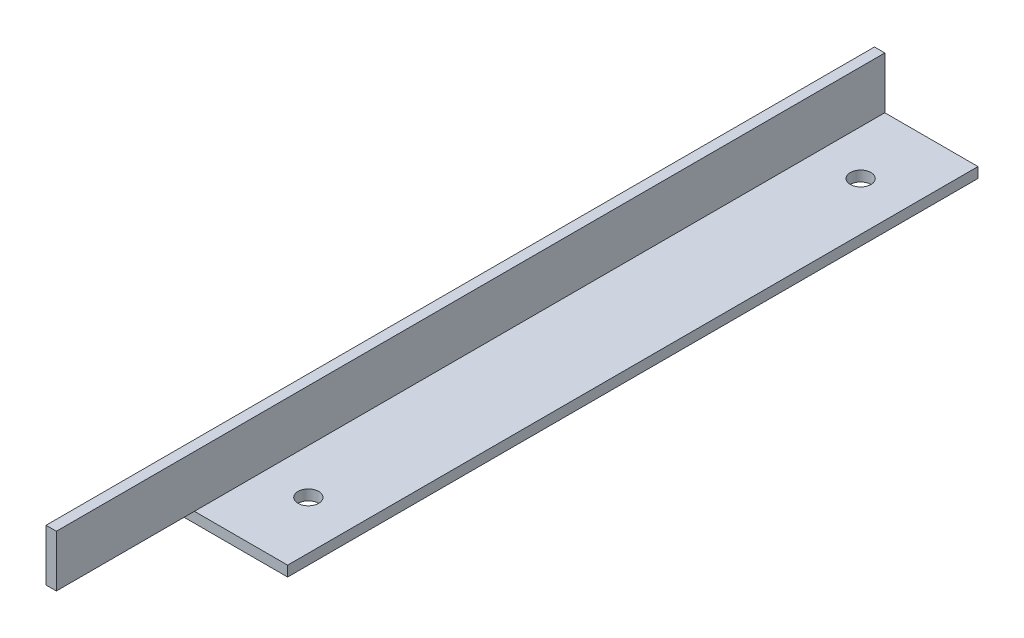
ISO-10303-21;
HEADER;
FILE_DESCRIPTION(('STEP AP214'),'2;1');
FILE_NAME('part.step','',(''),(''),'','','');
FILE_SCHEMA(('AUTOMOTIVE_DESIGN { 1 0 10303 214 1 1 1 1 }'));
ENDSEC;
DATA;
#1=APPLICATION_CONTEXT('core data for automotive mechanical design processes');
#2=APPLICATION_PROTOCOL_DEFINITION('international standard','automotive_design',2000,#1);
#3=PRODUCT_CONTEXT('',#1,'mechanical');
#4=PRODUCT('Part','Part','',(#3));
#5=PRODUCT_RELATED_PRODUCT_CATEGORY('part','',(#4));
#6=PRODUCT_DEFINITION_FORMATION('','',#4);
#7=PRODUCT_DEFINITION_CONTEXT('part definition',#1,'design');
#8=PRODUCT_DEFINITION('design','',#6,#7);
#9=PRODUCT_DEFINITION_SHAPE('','',#8);
#10=(LENGTH_UNIT() NAMED_UNIT(*) SI_UNIT(.MILLI.,.METRE.));
#11=(NAMED_UNIT(*) PLANE_ANGLE_UNIT() SI_UNIT($,.RADIAN.));
#12=(NAMED_UNIT(*) SI_UNIT($,.STERADIAN.) SOLID_ANGLE_UNIT());
#13=UNCERTAINTY_MEASURE_WITH_UNIT(LENGTH_MEASURE(1.E-05),#10,'distance_accuracy_value','');
#14=(GEOMETRIC_REPRESENTATION_CONTEXT(3) GLOBAL_UNCERTAINTY_ASSIGNED_CONTEXT((#13)) GLOBAL_UNIT_ASSIGNED_CONTEXT((#10,
#11,#12)) REPRESENTATION_CONTEXT('',''));
#15=CARTESIAN_POINT('',(0.,0.,0.));
#16=DIRECTION('',(0.,0.,1.));
#17=DIRECTION('',(1.,0.,0.));
#18=AXIS2_PLACEMENT_3D('',#15,#16,#17);
#19=CARTESIAN_POINT('',(-16.8407390114147,-0.545052631578941,100.));
#20=DIRECTION('',(0.,-1.,0.));
#21=DIRECTION('',(0.,0.,-1.));
#22=AXIS2_PLACEMENT_3D('',#19,#20,#21);
#23=PLANE('',#22);
#24=DIRECTION('',(-1.,0.,0.));
#25=VECTOR('',#24,1.);
#26=CARTESIAN_POINT('',(-16.8407390114147,-0.545052631578941,0.));
#27=LINE('',#26,#25);
#28=CARTESIAN_POINT('',(-16.8407390114147,-0.545052631578941,0.));
#29=VERTEX_POINT('',#28);
#30=CARTESIAN_POINT('',(-18.3407390114147,-0.545052631578941,0.));
#31=VERTEX_POINT('',#30);
#32=EDGE_CURVE('E144',#29,#31,#27,.T.);
#33=ORIENTED_EDGE('',*,*,#32,.T.);
#34=DIRECTION('',(0.,0.,-1.));
#35=VECTOR('',#34,1.);
#36=CARTESIAN_POINT('',(-18.3407390114147,-0.545052631578941,100.));
#37=LINE('',#36,#35);
#38=CARTESIAN_POINT('',(-18.3407390114147,-0.545052631578941,120.));
#39=VERTEX_POINT('',#38);
#40=EDGE_CURVE('E11',#39,#31,#37,.T.);
#41=ORIENTED_EDGE('',*,*,#40,.F.);
#42=DIRECTION('',(-1.,0.,0.));
#43=VECTOR('',#42,1.);
#44=CARTESIAN_POINT('',(-18.3407390114147,-0.545052631578941,120.));
#45=LINE('',#44,#43);
#46=CARTESIAN_POINT('',(-16.8407390114147,-0.545052631578941,120.));
#47=VERTEX_POINT('',#46);
#48=EDGE_CURVE('E118',#47,#39,#45,.T.);
#49=ORIENTED_EDGE('',*,*,#48,.F.);
#50=DIRECTION('',(0.,0.,-1.));
#51=VECTOR('',#50,1.);
#52=CARTESIAN_POINT('',(-16.8407390114147,-0.545052631578941,100.));
#53=LINE('',#52,#51);
#54=EDGE_CURVE('E143',#47,#29,#53,.T.);
#55=ORIENTED_EDGE('',*,*,#54,.T.);
#56=EDGE_LOOP('',(#33,#41,#49,#55));
#57=FACE_BOUND('',#56,.T.);
#58=ADVANCED_FACE('F31',(#57),#23,.F.);
#59=CARTESIAN_POINT('',(-18.3407390114147,-0.545052631578941,100.));
#60=DIRECTION('',(1.,0.,0.));
#61=DIRECTION('',(0.,1.,0.));
#62=AXIS2_PLACEMENT_3D('',#59,#60,#61);
#63=PLANE('',#62);
#64=DIRECTION('',(0.,-1.,0.));
#65=VECTOR('',#64,1.);
#66=CARTESIAN_POINT('',(-18.3407390114147,-0.545052631578941,0.));
#67=LINE('',#66,#65);
#68=CARTESIAN_POINT('',(-18.3407390114147,-9.54505263157894,0.));
#69=VERTEX_POINT('',#68);
#70=EDGE_CURVE('E147',#31,#69,#67,.T.);
#71=ORIENTED_EDGE('',*,*,#70,.T.);
#72=DIRECTION('',(0.,0.,-1.));
#73=VECTOR('',#72,1.);
#74=CARTESIAN_POINT('',(-18.3407390114147,-9.54505263157894,100.));
#75=LINE('',#74,#73);
#76=CARTESIAN_POINT('',(-18.3407390114147,-9.54505263157894,100.));
#77=VERTEX_POINT('',#76);
#78=EDGE_CURVE('E39',#77,#69,#75,.T.);
#79=ORIENTED_EDGE('',*,*,#78,.F.);
#80=DIRECTION('',(0.,-1.,0.));
#81=VECTOR('',#80,1.);
#82=CARTESIAN_POINT('',(-18.3407390114147,-0.545052631578941,100.));
#83=LINE('',#82,#81);
#84=CARTESIAN_POINT('',(-18.3407390114147,-8.04505263157894,100.));
#85=VERTEX_POINT('',#84);
#86=EDGE_CURVE('E83',#85,#77,#83,.T.);
#87=ORIENTED_EDGE('',*,*,#86,.F.);
#88=DIRECTION('',(0.,0.,-1.));
#89=VECTOR('',#88,1.);
#90=CARTESIAN_POINT('',(-18.3407390114147,-8.04505263157894,120.));
#91=LINE('',#90,#89);
#92=CARTESIAN_POINT('',(-18.3407390114147,-8.04505263157894,120.));
#93=VERTEX_POINT('',#92);
#94=EDGE_CURVE('E105',#93,#85,#91,.T.);
#95=ORIENTED_EDGE('',*,*,#94,.F.);
#96=DIRECTION('',(0.,-1.,0.));
#97=VECTOR('',#96,1.);
#98=CARTESIAN_POINT('',(-18.3407390114147,-0.545052631578941,120.));
#99=LINE('',#98,#97);
#100=EDGE_CURVE('E112',#39,#93,#99,.T.);
#101=ORIENTED_EDGE('',*,*,#100,.F.);
#102=ORIENTED_EDGE('',*,*,#40,.T.);
#103=EDGE_LOOP('',(#71,#79,#87,#95,#101,#102));
#104=FACE_BOUND('',#103,.T.);
#105=ADVANCED_FACE('F121',(#104),#63,.F.);
#106=CARTESIAN_POINT('',(-18.3407390114147,-9.54505263157894,100.));
#107=DIRECTION('',(0.,1.,0.));
#108=DIRECTION('',(0.,0.,1.));
#109=AXIS2_PLACEMENT_3D('',#106,#107,#108);
#110=PLANE('',#109);
#111=CARTESIAN_POINT('',(-10.3407390114147,-9.54505263157894,10.));
#112=DIRECTION('',(0.,1.,0.));
#113=DIRECTION('',(0.,0.,1.));
#114=AXIS2_PLACEMENT_3D('',#111,#112,#113);
#115=CIRCLE('',#114,1.5);
#116=CARTESIAN_POINT('',(-10.3407390114147,-9.54505263157894,11.5));
#117=VERTEX_POINT('',#116);
#118=EDGE_CURVE('E124',#117,#117,#115,.T.);
#119=ORIENTED_EDGE('',*,*,#118,.T.);
#120=EDGE_LOOP('',(#119));
#121=FACE_BOUND('',#120,.T.);
#122=CARTESIAN_POINT('',(-10.3407390114147,-9.54505263157894,90.));
#123=DIRECTION('',(0.,1.,0.));
#124=DIRECTION('',(0.,0.,1.));
#125=AXIS2_PLACEMENT_3D('',#122,#123,#124);
#126=CIRCLE('',#125,1.5);
#127=CARTESIAN_POINT('',(-10.3407390114147,-9.54505263157894,91.5));
#128=VERTEX_POINT('',#127);
#129=EDGE_CURVE('E137',#128,#128,#126,.T.);
#130=ORIENTED_EDGE('',*,*,#129,.T.);
#131=EDGE_LOOP('',(#130));
#132=FACE_BOUND('',#131,.T.);
#133=DIRECTION('',(1.,0.,0.));
#134=VECTOR('',#133,1.);
#135=CARTESIAN_POINT('',(-18.3407390114147,-9.54505263157894,0.));
#136=LINE('',#135,#134);
#137=CARTESIAN_POINT('',(-3.3407390114147,-9.54505263157894,0.));
#138=VERTEX_POINT('',#137);
#139=EDGE_CURVE('E149',#69,#138,#136,.T.);
#140=ORIENTED_EDGE('',*,*,#139,.T.);
#141=DIRECTION('',(0.,0.,-1.));
#142=VECTOR('',#141,1.);
#143=CARTESIAN_POINT('',(-3.3407390114147,-9.54505263157894,100.));
#144=LINE('',#143,#142);
#145=CARTESIAN_POINT('',(-3.3407390114147,-9.54505263157894,100.));
#146=VERTEX_POINT('',#145);
#147=EDGE_CURVE('E162',#146,#138,#144,.T.);
#148=ORIENTED_EDGE('',*,*,#147,.F.);
#149=DIRECTION('',(1.,0.,0.));
#150=VECTOR('',#149,1.);
#151=CARTESIAN_POINT('',(-18.3407390114147,-9.54505263157894,100.));
#152=LINE('',#151,#150);
#153=EDGE_CURVE('E132',#77,#146,#152,.T.);
#154=ORIENTED_EDGE('',*,*,#153,.F.);
#155=ORIENTED_EDGE('',*,*,#78,.T.);
#156=EDGE_LOOP('',(#140,#148,#154,#155));
#157=FACE_BOUND('',#156,.T.);
#158=ADVANCED_FACE('F168',(#121,#132,#157),#110,.F.);
#159=CARTESIAN_POINT('',(-3.3407390114147,-9.54505263157894,100.));
#160=DIRECTION('',(-1.,0.,0.));
#161=DIRECTION('',(0.,0.,1.));
#162=AXIS2_PLACEMENT_3D('',#159,#160,#161);
#163=PLANE('',#162);
#164=DIRECTION('',(0.,1.,0.));
#165=VECTOR('',#164,1.);
#166=CARTESIAN_POINT('',(-3.3407390114147,-9.54505263157894,0.));
#167=LINE('',#166,#165);
#168=CARTESIAN_POINT('',(-3.3407390114147,-8.04505263157894,0.));
#169=VERTEX_POINT('',#168);
#170=EDGE_CURVE('E151',#138,#169,#167,.T.);
#171=ORIENTED_EDGE('',*,*,#170,.T.);
#172=DIRECTION('',(0.,0.,-1.));
#173=VECTOR('',#172,1.);
#174=CARTESIAN_POINT('',(-3.3407390114147,-8.04505263157894,100.));
#175=LINE('',#174,#173);
#176=CARTESIAN_POINT('',(-3.3407390114147,-8.04505263157894,100.));
#177=VERTEX_POINT('',#176);
#178=EDGE_CURVE('E159',#177,#169,#175,.T.);
#179=ORIENTED_EDGE('',*,*,#178,.F.);
#180=DIRECTION('',(0.,1.,0.));
#181=VECTOR('',#180,1.);
#182=CARTESIAN_POINT('',(-3.3407390114147,-9.54505263157894,100.));
#183=LINE('',#182,#181);
#184=EDGE_CURVE('E54',#146,#177,#183,.T.);
#185=ORIENTED_EDGE('',*,*,#184,.F.);
#186=ORIENTED_EDGE('',*,*,#147,.T.);
#187=EDGE_LOOP('',(#171,#179,#185,#186));
#188=FACE_BOUND('',#187,.T.);
#189=ADVANCED_FACE('F176',(#188),#163,.F.);
#190=CARTESIAN_POINT('',(-3.3407390114147,-8.04505263157894,100.));
#191=DIRECTION('',(0.,-1.,0.));
#192=DIRECTION('',(1.,0.,0.));
#193=AXIS2_PLACEMENT_3D('',#190,#191,#192);
#194=PLANE('',#193);
#195=CARTESIAN_POINT('',(-10.3407390114147,-8.04505263157894,10.));
#196=DIRECTION('',(0.,1.,0.));
#197=DIRECTION('',(-1.,0.,0.));
#198=AXIS2_PLACEMENT_3D('',#195,#196,#197);
#199=CIRCLE('',#198,1.5);
#200=CARTESIAN_POINT('',(-11.8407390114147,-8.04505263157894,10.));
#201=VERTEX_POINT('',#200);
#202=EDGE_CURVE('E122',#201,#201,#199,.T.);
#203=ORIENTED_EDGE('',*,*,#202,.F.);
#204=EDGE_LOOP('',(#203));
#205=FACE_BOUND('',#204,.T.);
#206=CARTESIAN_POINT('',(-10.3407390114147,-8.04505263157894,90.));
#207=DIRECTION('',(0.,1.,0.));
#208=DIRECTION('',(-1.,0.,0.));
#209=AXIS2_PLACEMENT_3D('',#206,#207,#208);
#210=CIRCLE('',#209,1.5);
#211=CARTESIAN_POINT('',(-11.8407390114147,-8.04505263157894,90.));
#212=VERTEX_POINT('',#211);
#213=EDGE_CURVE('E186',#212,#212,#210,.T.);
#214=ORIENTED_EDGE('',*,*,#213,.F.);
#215=EDGE_LOOP('',(#214));
#216=FACE_BOUND('',#215,.T.);
#217=DIRECTION('',(-1.,0.,0.));
#218=VECTOR('',#217,1.);
#219=CARTESIAN_POINT('',(-3.3407390114147,-8.04505263157894,0.));
#220=LINE('',#219,#218);
#221=CARTESIAN_POINT('',(-16.8407390114147,-8.04505263157894,0.));
#222=VERTEX_POINT('',#221);
#223=EDGE_CURVE('E153',#169,#222,#220,.T.);
#224=ORIENTED_EDGE('',*,*,#223,.T.);
#225=DIRECTION('',(0.,0.,-1.));
#226=VECTOR('',#225,1.);
#227=CARTESIAN_POINT('',(-16.8407390114147,-8.04505263157894,100.));
#228=LINE('',#227,#226);
#229=CARTESIAN_POINT('',(-16.8407390114147,-8.04505263157894,100.));
#230=VERTEX_POINT('',#229);
#231=EDGE_CURVE('E157',#230,#222,#228,.T.);
#232=ORIENTED_EDGE('',*,*,#231,.F.);
#233=DIRECTION('',(-1.,0.,0.));
#234=VECTOR('',#233,1.);
#235=CARTESIAN_POINT('',(-3.3407390114147,-8.04505263157894,100.));
#236=LINE('',#235,#234);
#237=EDGE_CURVE('E141',#177,#230,#236,.T.);
#238=ORIENTED_EDGE('',*,*,#237,.F.);
#239=ORIENTED_EDGE('',*,*,#178,.T.);
#240=EDGE_LOOP('',(#224,#232,#238,#239));
#241=FACE_BOUND('',#240,.T.);
#242=ADVANCED_FACE('F179',(#205,#216,#241),#194,.F.);
#243=CARTESIAN_POINT('',(-16.8407390114147,-8.04505263157894,100.));
#244=DIRECTION('',(-1.,0.,0.));
#245=DIRECTION('',(0.,0.,1.));
#246=AXIS2_PLACEMENT_3D('',#243,#244,#245);
#247=PLANE('',#246);
#248=DIRECTION('',(0.,1.,0.));
#249=VECTOR('',#248,1.);
#250=CARTESIAN_POINT('',(-16.8407390114147,-8.04505263157894,0.));
#251=LINE('',#250,#249);
#252=EDGE_CURVE('E81',#222,#29,#251,.T.);
#253=ORIENTED_EDGE('',*,*,#252,.T.);
#254=ORIENTED_EDGE('',*,*,#54,.F.);
#255=DIRECTION('',(0.,1.,0.));
#256=VECTOR('',#255,1.);
#257=CARTESIAN_POINT('',(-16.8407390114147,-0.545052631578941,120.));
#258=LINE('',#257,#256);
#259=CARTESIAN_POINT('',(-16.8407390114147,-8.04505263157894,120.));
#260=VERTEX_POINT('',#259);
#261=EDGE_CURVE('E111',#260,#47,#258,.T.);
#262=ORIENTED_EDGE('',*,*,#261,.F.);
#263=DIRECTION('',(0.,0.,-1.));
#264=VECTOR('',#263,1.);
#265=CARTESIAN_POINT('',(-16.8407390114147,-8.04505263157894,120.));
#266=LINE('',#265,#264);
#267=EDGE_CURVE('E107',#260,#230,#266,.T.);
#268=ORIENTED_EDGE('',*,*,#267,.T.);
#269=ORIENTED_EDGE('',*,*,#231,.T.);
#270=EDGE_LOOP('',(#253,#254,#262,#268,#269));
#271=FACE_BOUND('',#270,.T.);
#272=ADVANCED_FACE('F181',(#271),#247,.F.);
#273=CARTESIAN_POINT('',(-18.3407390114147,-0.545052631578941,100.));
#274=DIRECTION('',(0.,0.,1.));
#275=DIRECTION('',(1.,0.,0.));
#276=AXIS2_PLACEMENT_3D('',#273,#274,#275);
#277=PLANE('',#276);
#278=DIRECTION('',(1.,0.,0.));
#279=VECTOR('',#278,1.);
#280=CARTESIAN_POINT('',(-18.3407390114147,-8.04505263157894,100.));
#281=LINE('',#280,#279);
#282=EDGE_CURVE('E47',#85,#230,#281,.T.);
#283=ORIENTED_EDGE('',*,*,#282,.F.);
#284=ORIENTED_EDGE('',*,*,#86,.T.);
#285=ORIENTED_EDGE('',*,*,#153,.T.);
#286=ORIENTED_EDGE('',*,*,#184,.T.);
#287=ORIENTED_EDGE('',*,*,#237,.T.);
#288=EDGE_LOOP('',(#283,#284,#285,#286,#287));
#289=FACE_BOUND('',#288,.T.);
#290=ADVANCED_FACE('F180',(#289),#277,.T.);
#291=CARTESIAN_POINT('',(-18.3407390114147,-0.545052631578941,0.));
#292=DIRECTION('',(0.,0.,1.));
#293=DIRECTION('',(1.,0.,0.));
#294=AXIS2_PLACEMENT_3D('',#291,#292,#293);
#295=PLANE('',#294);
#296=ORIENTED_EDGE('',*,*,#32,.F.);
#297=ORIENTED_EDGE('',*,*,#252,.F.);
#298=ORIENTED_EDGE('',*,*,#223,.F.);
#299=ORIENTED_EDGE('',*,*,#170,.F.);
#300=ORIENTED_EDGE('',*,*,#139,.F.);
#301=ORIENTED_EDGE('',*,*,#70,.F.);
#302=EDGE_LOOP('',(#296,#297,#298,#299,#300,#301));
#303=FACE_BOUND('',#302,.T.);
#304=ADVANCED_FACE('F173',(#303),#295,.F.);
#305=CARTESIAN_POINT('',(-10.3407390114147,-128.045052631579,90.));
#306=DIRECTION('',(0.,1.,0.));
#307=DIRECTION('',(-1.,0.,0.));
#308=AXIS2_PLACEMENT_3D('',#305,#306,#307);
#309=CYLINDRICAL_SURFACE('',#308,1.5);
#310=ORIENTED_EDGE('',*,*,#213,.T.);
#311=EDGE_LOOP('',(#310));
#312=FACE_BOUND('',#311,.T.);
#313=ORIENTED_EDGE('',*,*,#129,.F.);
#314=EDGE_LOOP('',(#313));
#315=FACE_BOUND('',#314,.T.);
#316=ADVANCED_FACE('F194',(#312,#315),#309,.F.);
#317=CARTESIAN_POINT('',(-10.3407390114147,-128.045052631579,10.));
#318=DIRECTION('',(0.,1.,0.));
#319=DIRECTION('',(-1.,0.,0.));
#320=AXIS2_PLACEMENT_3D('',#317,#318,#319);
#321=CYLINDRICAL_SURFACE('',#320,1.5);
#322=ORIENTED_EDGE('',*,*,#202,.T.);
#323=EDGE_LOOP('',(#322));
#324=FACE_BOUND('',#323,.T.);
#325=ORIENTED_EDGE('',*,*,#118,.F.);
#326=EDGE_LOOP('',(#325));
#327=FACE_BOUND('',#326,.T.);
#328=ADVANCED_FACE('F196',(#324,#327),#321,.F.);
#329=CARTESIAN_POINT('',(-18.3407390114147,-8.04505263157894,120.));
#330=DIRECTION('',(0.,1.,0.));
#331=DIRECTION('',(0.,0.,1.));
#332=AXIS2_PLACEMENT_3D('',#329,#330,#331);
#333=PLANE('',#332);
#334=ORIENTED_EDGE('',*,*,#282,.T.);
#335=ORIENTED_EDGE('',*,*,#267,.F.);
#336=DIRECTION('',(1.,0.,0.));
#337=VECTOR('',#336,1.);
#338=CARTESIAN_POINT('',(-18.3407390114147,-8.04505263157894,120.));
#339=LINE('',#338,#337);
#340=EDGE_CURVE('E101',#93,#260,#339,.T.);
#341=ORIENTED_EDGE('',*,*,#340,.F.);
#342=ORIENTED_EDGE('',*,*,#94,.T.);
#343=EDGE_LOOP('',(#334,#335,#341,#342));
#344=FACE_BOUND('',#343,.T.);
#345=ADVANCED_FACE('F103',(#344),#333,.F.);
#346=CARTESIAN_POINT('',(-18.3407390114147,-8.04505263157894,120.));
#347=DIRECTION('',(0.,0.,1.));
#348=DIRECTION('',(1.,0.,0.));
#349=AXIS2_PLACEMENT_3D('',#346,#347,#348);
#350=PLANE('',#349);
#351=ORIENTED_EDGE('',*,*,#100,.T.);
#352=ORIENTED_EDGE('',*,*,#340,.T.);
#353=ORIENTED_EDGE('',*,*,#261,.T.);
#354=ORIENTED_EDGE('',*,*,#48,.T.);
#355=EDGE_LOOP('',(#351,#352,#353,#354));
#356=FACE_BOUND('',#355,.T.);
#357=ADVANCED_FACE('F116',(#356),#350,.T.);
#358=CLOSED_SHELL('',(#58,#105,#158,#189,#242,#272,#290,#304,#316,#328,#345,#357));
#359=MANIFOLD_SOLID_BREP('B2',#358);
#360=ADVANCED_BREP_SHAPE_REPRESENTATION('',(#18,#359),#14);
#361=SHAPE_DEFINITION_REPRESENTATION(#9,#360);
ENDSEC;
END-ISO-10303-21;
